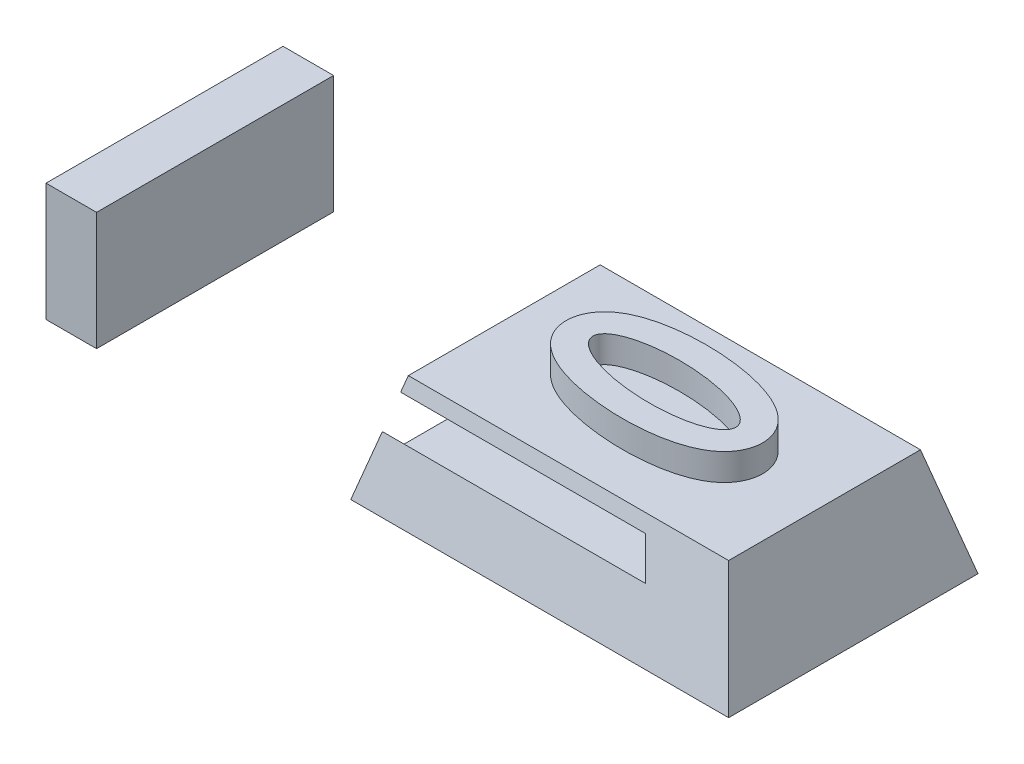
ISO-10303-21;
HEADER;
FILE_DESCRIPTION(('STEP AP214'),'2;1');
FILE_NAME('part.step','',(''),(''),'','','');
FILE_SCHEMA(('AUTOMOTIVE_DESIGN { 1 0 10303 214 1 1 1 1 }'));
ENDSEC;
DATA;
#1=APPLICATION_CONTEXT('core data for automotive mechanical design processes');
#2=APPLICATION_PROTOCOL_DEFINITION('international standard','automotive_design',2000,#1);
#3=PRODUCT_CONTEXT('',#1,'mechanical');
#4=PRODUCT('Part','Part','',(#3));
#5=PRODUCT_RELATED_PRODUCT_CATEGORY('part','',(#4));
#6=PRODUCT_DEFINITION_FORMATION('','',#4);
#7=PRODUCT_DEFINITION_CONTEXT('part definition',#1,'design');
#8=PRODUCT_DEFINITION('design','',#6,#7);
#9=PRODUCT_DEFINITION_SHAPE('','',#8);
#10=(LENGTH_UNIT() NAMED_UNIT(*) SI_UNIT(.MILLI.,.METRE.));
#11=(NAMED_UNIT(*) PLANE_ANGLE_UNIT() SI_UNIT($,.RADIAN.));
#12=(NAMED_UNIT(*) SI_UNIT($,.STERADIAN.) SOLID_ANGLE_UNIT());
#13=UNCERTAINTY_MEASURE_WITH_UNIT(LENGTH_MEASURE(1.E-05),#10,'distance_accuracy_value','');
#14=(GEOMETRIC_REPRESENTATION_CONTEXT(3) GLOBAL_UNCERTAINTY_ASSIGNED_CONTEXT((#13)) GLOBAL_UNIT_ASSIGNED_CONTEXT((#10,
#11,#12)) REPRESENTATION_CONTEXT('',''));
#15=CARTESIAN_POINT('',(0.,0.,0.));
#16=DIRECTION('',(0.,0.,1.));
#17=DIRECTION('',(1.,0.,0.));
#18=AXIS2_PLACEMENT_3D('',#15,#16,#17);
#19=CARTESIAN_POINT('',(-83.2062043670231,22.,-21.5865152838973));
#20=DIRECTION('',(-1.,0.,0.));
#21=DIRECTION('',(0.,0.,1.));
#22=AXIS2_PLACEMENT_3D('',#19,#20,#21);
#23=PLANE('',#22);
#24=DIRECTION('',(0.,0.,-1.));
#25=VECTOR('',#24,1.);
#26=CARTESIAN_POINT('',(-83.2062043670231,0.,-21.5865152838973));
#27=LINE('',#26,#25);
#28=CARTESIAN_POINT('',(-83.2062043670231,0.,22.5677205240746));
#29=VERTEX_POINT('',#28);
#30=CARTESIAN_POINT('',(-83.2062043670231,0.,-21.5865152838973));
#31=VERTEX_POINT('',#30);
#32=EDGE_CURVE('E132',#29,#31,#27,.T.);
#33=ORIENTED_EDGE('',*,*,#32,.T.);
#34=DIRECTION('',(0.,-1.,0.));
#35=VECTOR('',#34,1.);
#36=CARTESIAN_POINT('',(-83.2062043670231,22.,-21.5865152838973));
#37=LINE('',#36,#35);
#38=CARTESIAN_POINT('',(-83.2062043670231,22.,-21.5865152838973));
#39=VERTEX_POINT('',#38);
#40=EDGE_CURVE('E13',#39,#31,#37,.T.);
#41=ORIENTED_EDGE('',*,*,#40,.F.);
#42=DIRECTION('',(0.,0.,-1.));
#43=VECTOR('',#42,1.);
#44=CARTESIAN_POINT('',(-83.2062043670231,22.,-21.5865152838973));
#45=LINE('',#44,#43);
#46=CARTESIAN_POINT('',(-83.2062043670231,22.,22.5677205240746));
#47=VERTEX_POINT('',#46);
#48=EDGE_CURVE('E120',#47,#39,#45,.T.);
#49=ORIENTED_EDGE('',*,*,#48,.F.);
#50=DIRECTION('',(0.,-1.,0.));
#51=VECTOR('',#50,1.);
#52=CARTESIAN_POINT('',(-83.2062043670231,22.,22.5677205240746));
#53=LINE('',#52,#51);
#54=EDGE_CURVE('E128',#47,#29,#53,.T.);
#55=ORIENTED_EDGE('',*,*,#54,.T.);
#56=EDGE_LOOP('',(#33,#41,#49,#55));
#57=FACE_BOUND('',#56,.T.);
#58=ADVANCED_FACE('F69',(#57),#23,.F.);
#59=CARTESIAN_POINT('',(-92.6257746727238,22.,-21.5865152838973));
#60=DIRECTION('',(0.,0.,1.));
#61=DIRECTION('',(1.,0.,0.));
#62=AXIS2_PLACEMENT_3D('',#59,#60,#61);
#63=PLANE('',#62);
#64=DIRECTION('',(-1.,0.,0.));
#65=VECTOR('',#64,1.);
#66=CARTESIAN_POINT('',(-92.6257746727238,0.,-21.5865152838973));
#67=LINE('',#66,#65);
#68=CARTESIAN_POINT('',(-92.6257746727238,0.,-21.5865152838973));
#69=VERTEX_POINT('',#68);
#70=EDGE_CURVE('E124',#31,#69,#67,.T.);
#71=ORIENTED_EDGE('',*,*,#70,.T.);
#72=DIRECTION('',(0.,-1.,0.));
#73=VECTOR('',#72,1.);
#74=CARTESIAN_POINT('',(-92.6257746727238,22.,-21.5865152838973));
#75=LINE('',#74,#73);
#76=CARTESIAN_POINT('',(-92.6257746727238,22.,-21.5865152838973));
#77=VERTEX_POINT('',#76);
#78=EDGE_CURVE('E77',#77,#69,#75,.T.);
#79=ORIENTED_EDGE('',*,*,#78,.F.);
#80=DIRECTION('',(-1.,0.,0.));
#81=VECTOR('',#80,1.);
#82=CARTESIAN_POINT('',(-92.6257746727238,22.,-21.5865152838973));
#83=LINE('',#82,#81);
#84=EDGE_CURVE('E115',#39,#77,#83,.T.);
#85=ORIENTED_EDGE('',*,*,#84,.F.);
#86=ORIENTED_EDGE('',*,*,#40,.T.);
#87=EDGE_LOOP('',(#71,#79,#85,#86));
#88=FACE_BOUND('',#87,.T.);
#89=ADVANCED_FACE('F123',(#88),#63,.F.);
#90=CARTESIAN_POINT('',(-92.6257746727238,22.,-21.5865152838973));
#91=DIRECTION('',(1.,0.,0.));
#92=DIRECTION('',(0.,0.,-1.));
#93=AXIS2_PLACEMENT_3D('',#90,#91,#92);
#94=PLANE('',#93);
#95=DIRECTION('',(0.,0.,1.));
#96=VECTOR('',#95,1.);
#97=CARTESIAN_POINT('',(-92.6257746727238,0.,-21.5865152838973));
#98=LINE('',#97,#96);
#99=CARTESIAN_POINT('',(-92.6257746727238,0.,22.5677205240746));
#100=VERTEX_POINT('',#99);
#101=EDGE_CURVE('E102',#69,#100,#98,.T.);
#102=ORIENTED_EDGE('',*,*,#101,.T.);
#103=DIRECTION('',(0.,-1.,0.));
#104=VECTOR('',#103,1.);
#105=CARTESIAN_POINT('',(-92.6257746727238,22.,22.5677205240746));
#106=LINE('',#105,#104);
#107=CARTESIAN_POINT('',(-92.6257746727238,22.,22.5677205240746));
#108=VERTEX_POINT('',#107);
#109=EDGE_CURVE('E125',#108,#100,#106,.T.);
#110=ORIENTED_EDGE('',*,*,#109,.F.);
#111=DIRECTION('',(0.,0.,1.));
#112=VECTOR('',#111,1.);
#113=CARTESIAN_POINT('',(-92.6257746727238,22.,-21.5865152838973));
#114=LINE('',#113,#112);
#115=EDGE_CURVE('E118',#77,#108,#114,.T.);
#116=ORIENTED_EDGE('',*,*,#115,.F.);
#117=ORIENTED_EDGE('',*,*,#78,.T.);
#118=EDGE_LOOP('',(#102,#110,#116,#117));
#119=FACE_BOUND('',#118,.T.);
#120=ADVANCED_FACE('F126',(#119),#94,.F.);
#121=CARTESIAN_POINT('',(-92.6257746727238,22.,22.5677205240746));
#122=DIRECTION('',(0.,0.,-1.));
#123=DIRECTION('',(-1.,0.,0.));
#124=AXIS2_PLACEMENT_3D('',#121,#122,#123);
#125=PLANE('',#124);
#126=DIRECTION('',(1.,0.,0.));
#127=VECTOR('',#126,1.);
#128=CARTESIAN_POINT('',(-92.6257746727238,0.,22.5677205240746));
#129=LINE('',#128,#127);
#130=EDGE_CURVE('E108',#100,#29,#129,.T.);
#131=ORIENTED_EDGE('',*,*,#130,.T.);
#132=ORIENTED_EDGE('',*,*,#54,.F.);
#133=DIRECTION('',(1.,0.,0.));
#134=VECTOR('',#133,1.);
#135=CARTESIAN_POINT('',(-92.6257746727238,22.,22.5677205240746));
#136=LINE('',#135,#134);
#137=EDGE_CURVE('E85',#108,#47,#136,.T.);
#138=ORIENTED_EDGE('',*,*,#137,.F.);
#139=ORIENTED_EDGE('',*,*,#109,.T.);
#140=EDGE_LOOP('',(#131,#132,#138,#139));
#141=FACE_BOUND('',#140,.T.);
#142=ADVANCED_FACE('F139',(#141),#125,.F.);
#143=CARTESIAN_POINT('',(0.,22.,0.));
#144=DIRECTION('',(0.,1.,0.));
#145=DIRECTION('',(0.,0.,1.));
#146=AXIS2_PLACEMENT_3D('',#143,#144,#145);
#147=PLANE('',#146);
#148=ORIENTED_EDGE('',*,*,#48,.T.);
#149=ORIENTED_EDGE('',*,*,#84,.T.);
#150=ORIENTED_EDGE('',*,*,#115,.T.);
#151=ORIENTED_EDGE('',*,*,#137,.T.);
#152=EDGE_LOOP('',(#148,#149,#150,#151));
#153=FACE_BOUND('',#152,.T.);
#154=ADVANCED_FACE('F116',(#153),#147,.T.);
#155=CARTESIAN_POINT('',(0.,0.,0.));
#156=DIRECTION('',(0.,1.,0.));
#157=DIRECTION('',(0.,0.,1.));
#158=AXIS2_PLACEMENT_3D('',#155,#156,#157);
#159=PLANE('',#158);
#160=ORIENTED_EDGE('',*,*,#32,.F.);
#161=ORIENTED_EDGE('',*,*,#130,.F.);
#162=ORIENTED_EDGE('',*,*,#101,.F.);
#163=ORIENTED_EDGE('',*,*,#70,.F.);
#164=EDGE_LOOP('',(#160,#161,#162,#163));
#165=FACE_BOUND('',#164,.T.);
#166=ADVANCED_FACE('F142',(#165),#159,.F.);
#167=CLOSED_SHELL('',(#58,#89,#120,#142,#154,#166));
#168=MANIFOLD_SOLID_BREP('B2',#167);
#169=CARTESIAN_POINT('',(-35.192375446695,0.,-23.2269677948187));
#170=DIRECTION('',(-0.965925826289068,0.258819045102521,0.));
#171=DIRECTION('',(-0.258819045102521,-0.965925826289068,0.));
#172=AXIS2_PLACEMENT_3D('',#169,#170,#171);
#173=PLANE('',#172);
#174=DIRECTION('',(0.,0.,1.));
#175=VECTOR('',#174,1.);
#176=CARTESIAN_POINT('',(-30.5489939558643,17.3293356427049,-23.2269677948187));
#177=LINE('',#176,#175);
#178=CARTESIAN_POINT('',(-30.5489939558643,17.3293356427049,18.583586303988));
#179=VERTEX_POINT('',#178);
#180=CARTESIAN_POINT('',(-30.5489939558643,17.3293356427049,-16.2991762572844));
#181=VERTEX_POINT('',#180);
#182=EDGE_CURVE('E314',#179,#181,#177,.F.);
#183=ORIENTED_EDGE('',*,*,#182,.F.);
#184=DIRECTION('',(-0.250562807085732,-0.935113126531029,0.250562807085732));
#185=VECTOR('',#184,1.);
#186=CARTESIAN_POINT('',(-35.192375446695,0.,23.2269677948187));
#187=LINE('',#186,#185);
#188=CARTESIAN_POINT('',(-29.8333915980725,20.,17.8679839461962));
#189=VERTEX_POINT('',#188);
#190=EDGE_CURVE('E375',#189,#179,#187,.T.);
#191=ORIENTED_EDGE('',*,*,#190,.F.);
#192=DIRECTION('',(0.,0.,1.));
#193=VECTOR('',#192,1.);
#194=CARTESIAN_POINT('',(-29.8333915980725,20.,-23.2269677948187));
#195=LINE('',#194,#193);
#196=CARTESIAN_POINT('',(-29.8333915980725,20.,-17.8679839461962));
#197=VERTEX_POINT('',#196);
#198=EDGE_CURVE('E337',#189,#197,#195,.F.);
#199=ORIENTED_EDGE('',*,*,#198,.T.);
#200=DIRECTION('',(-0.250562807085732,-0.935113126531029,-0.250562807085732));
#201=VECTOR('',#200,1.);
#202=CARTESIAN_POINT('',(-35.192375446695,0.,-23.2269677948187));
#203=LINE('',#202,#201);
#204=CARTESIAN_POINT('',(-35.192375446695,0.,-23.2269677948187));
#205=VERTEX_POINT('',#204);
#206=EDGE_CURVE('E371',#197,#205,#203,.T.);
#207=ORIENTED_EDGE('',*,*,#206,.T.);
#208=DIRECTION('',(0.,0.,1.));
#209=VECTOR('',#208,1.);
#210=CARTESIAN_POINT('',(-35.192375446695,0.,-23.2269677948187));
#211=LINE('',#210,#209);
#212=CARTESIAN_POINT('',(-35.192375446695,0.,-16.2991762572844));
#213=VERTEX_POINT('',#212);
#214=EDGE_CURVE('E359',#205,#213,#211,.T.);
#215=ORIENTED_EDGE('',*,*,#214,.T.);
#216=DIRECTION('',(0.258819045102521,0.965925826289068,0.));
#217=VECTOR('',#216,1.);
#218=CARTESIAN_POINT('',(-35.192375446695,0.,-16.2991762572844));
#219=LINE('',#218,#217);
#220=CARTESIAN_POINT('',(-34.0763582072008,4.16503303991518,-16.2991762572844));
#221=VERTEX_POINT('',#220);
#222=EDGE_CURVE('E219',#221,#213,#219,.F.);
#223=ORIENTED_EDGE('',*,*,#222,.F.);
#224=DIRECTION('',(0.,0.,1.));
#225=VECTOR('',#224,1.);
#226=CARTESIAN_POINT('',(-34.0763582072008,4.16503303991518,-23.2269677948187));
#227=LINE('',#226,#225);
#228=CARTESIAN_POINT('',(-34.0763582072008,4.16503303991517,20.286381877483));
#229=VERTEX_POINT('',#228);
#230=EDGE_CURVE('E330',#229,#221,#227,.F.);
#231=ORIENTED_EDGE('',*,*,#230,.F.);
#232=DIRECTION('',(-0.258819045102521,-0.965925826289068,0.));
#233=VECTOR('',#232,1.);
#234=CARTESIAN_POINT('',(-35.192375446695,0.,20.286381877483));
#235=LINE('',#234,#233);
#236=CARTESIAN_POINT('',(-35.192375446695,0.,20.286381877483));
#237=VERTEX_POINT('',#236);
#238=EDGE_CURVE('E333',#237,#229,#235,.F.);
#239=ORIENTED_EDGE('',*,*,#238,.F.);
#240=CARTESIAN_POINT('',(-35.192375446695,0.,23.2269677948187));
#241=VERTEX_POINT('',#240);
#242=EDGE_CURVE('E358',#237,#241,#211,.T.);
#243=ORIENTED_EDGE('',*,*,#242,.T.);
#244=CARTESIAN_POINT('',(-32.2517895293593,10.9744160475184,20.286381877483));
#245=VERTEX_POINT('',#244);
#246=EDGE_CURVE('E374',#245,#241,#187,.T.);
#247=ORIENTED_EDGE('',*,*,#246,.F.);
#248=DIRECTION('',(-0.258819045102521,-0.965925826289068,0.));
#249=VECTOR('',#248,1.);
#250=CARTESIAN_POINT('',(-35.192375446695,0.,20.286381877483));
#251=LINE('',#250,#249);
#252=CARTESIAN_POINT('',(-33.7349477329932,5.43919427589401,20.286381877483));
#253=VERTEX_POINT('',#252);
#254=EDGE_CURVE('E310',#253,#245,#251,.F.);
#255=ORIENTED_EDGE('',*,*,#254,.F.);
#256=DIRECTION('',(0.,0.,1.));
#257=VECTOR('',#256,1.);
#258=CARTESIAN_POINT('',(-33.7349477329932,5.43919427589401,-23.2269677948187));
#259=LINE('',#258,#257);
#260=CARTESIAN_POINT('',(-33.7349477329932,5.43919427589401,-16.2991762572844));
#261=VERTEX_POINT('',#260);
#262=EDGE_CURVE('E204',#253,#261,#259,.F.);
#263=ORIENTED_EDGE('',*,*,#262,.T.);
#264=DIRECTION('',(-0.258819045102521,-0.965925826289068,0.));
#265=VECTOR('',#264,1.);
#266=CARTESIAN_POINT('',(-35.192375446695,0.,-16.2991762572844));
#267=LINE('',#266,#265);
#268=EDGE_CURVE('E67',#261,#181,#267,.F.);
#269=ORIENTED_EDGE('',*,*,#268,.T.);
#270=EDGE_LOOP('',(#183,#191,#199,#207,#215,#223,#231,#239,#243,#247,#255,#263,#269));
#271=FACE_BOUND('',#270,.T.);
#272=ADVANCED_FACE('F194',(#271),#173,.T.);
#273=CARTESIAN_POINT('',(-35.192375446695,0.,23.2269677948187));
#274=DIRECTION('',(0.,0.258819045102521,0.965925826289068));
#275=DIRECTION('',(0.,-0.965925826289068,0.258819045102521));
#276=AXIS2_PLACEMENT_3D('',#273,#274,#275);
#277=PLANE('',#276);
#278=DIRECTION('',(1.,0.,0.));
#279=VECTOR('',#278,1.);
#280=CARTESIAN_POINT('',(-35.192375446695,17.3293356427049,18.583586303988));
#281=LINE('',#280,#279);
#282=CARTESIAN_POINT('',(15.0198512497131,17.3293356427049,18.583586303988));
#283=VERTEX_POINT('',#282);
#284=EDGE_CURVE('E606',#283,#179,#281,.F.);
#285=ORIENTED_EDGE('',*,*,#284,.F.);
#286=DIRECTION('',(-0.250562807085732,0.935113126531029,-0.250562807085732));
#287=VECTOR('',#286,1.);
#288=CARTESIAN_POINT('',(16.2193032907379,12.8529196843582,19.7830383450128));
#289=LINE('',#288,#287);
#290=CARTESIAN_POINT('',(16.722646823208,10.9744160475183,20.286381877483));
#291=VERTEX_POINT('',#290);
#292=EDGE_CURVE('E601',#291,#283,#289,.T.);
#293=ORIENTED_EDGE('',*,*,#292,.F.);
#294=DIRECTION('',(-1.,0.,0.));
#295=VECTOR('',#294,1.);
#296=CARTESIAN_POINT('',(-35.192375446695,10.9744160475184,20.286381877483));
#297=LINE('',#296,#295);
#298=EDGE_CURVE('E290',#245,#291,#297,.F.);
#299=ORIENTED_EDGE('',*,*,#298,.F.);
#300=ORIENTED_EDGE('',*,*,#246,.T.);
#301=DIRECTION('',(1.,0.,0.));
#302=VECTOR('',#301,1.);
#303=CARTESIAN_POINT('',(-35.192375446695,0.,23.2269677948187));
#304=LINE('',#303,#302);
#305=CARTESIAN_POINT('',(35.192375446695,0.,23.2269677948187));
#306=VERTEX_POINT('',#305);
#307=EDGE_CURVE('E363',#241,#306,#304,.T.);
#308=ORIENTED_EDGE('',*,*,#307,.T.);
#309=DIRECTION('',(0.250562807085732,-0.935113126531029,0.250562807085732));
#310=VECTOR('',#309,1.);
#311=CARTESIAN_POINT('',(32.2759174559192,10.8843693997154,20.3105098040429));
#312=LINE('',#311,#310);
#313=CARTESIAN_POINT('',(29.8333915980725,20.,17.8679839461962));
#314=VERTEX_POINT('',#313);
#315=EDGE_CURVE('E367',#314,#306,#312,.T.);
#316=ORIENTED_EDGE('',*,*,#315,.F.);
#317=DIRECTION('',(1.,0.,0.));
#318=VECTOR('',#317,1.);
#319=CARTESIAN_POINT('',(-35.192375446695,20.,17.8679839461962));
#320=LINE('',#319,#318);
#321=EDGE_CURVE('E342',#314,#189,#320,.F.);
#322=ORIENTED_EDGE('',*,*,#321,.T.);
#323=ORIENTED_EDGE('',*,*,#190,.T.);
#324=EDGE_LOOP('',(#285,#293,#299,#300,#308,#316,#322,#323));
#325=FACE_BOUND('',#324,.T.);
#326=ADVANCED_FACE('F425',(#325),#277,.T.);
#327=CARTESIAN_POINT('',(0.,0.,0.));
#328=DIRECTION('',(0.,1.,0.));
#329=DIRECTION('',(0.,0.,1.));
#330=AXIS2_PLACEMENT_3D('',#327,#328,#329);
#331=PLANE('',#330);
#332=DIRECTION('',(-1.,0.,0.));
#333=VECTOR('',#332,1.);
#334=CARTESIAN_POINT('',(0.,0.,20.286381877483));
#335=LINE('',#334,#333);
#336=CARTESIAN_POINT('',(-18.5322432870343,0.,20.286381877483));
#337=VERTEX_POINT('',#336);
#338=EDGE_CURVE('E596',#337,#237,#335,.T.);
#339=ORIENTED_EDGE('',*,*,#338,.F.);
#340=DIRECTION('',(0.,0.,1.));
#341=VECTOR('',#340,1.);
#342=CARTESIAN_POINT('',(-18.5322432870343,0.,0.));
#343=LINE('',#342,#341);
#344=CARTESIAN_POINT('',(-18.5322432870343,0.,-16.2991762572844));
#345=VERTEX_POINT('',#344);
#346=EDGE_CURVE('E593',#345,#337,#343,.T.);
#347=ORIENTED_EDGE('',*,*,#346,.F.);
#348=DIRECTION('',(1.,0.,0.));
#349=VECTOR('',#348,1.);
#350=CARTESIAN_POINT('',(0.,0.,-16.2991762572844));
#351=LINE('',#350,#349);
#352=EDGE_CURVE('E390',#213,#345,#351,.T.);
#353=ORIENTED_EDGE('',*,*,#352,.F.);
#354=ORIENTED_EDGE('',*,*,#214,.F.);
#355=DIRECTION('',(-1.,0.,0.));
#356=VECTOR('',#355,1.);
#357=CARTESIAN_POINT('',(-35.192375446695,0.,-23.2269677948187));
#358=LINE('',#357,#356);
#359=CARTESIAN_POINT('',(35.192375446695,0.,-23.2269677948187));
#360=VERTEX_POINT('',#359);
#361=EDGE_CURVE('E354',#360,#205,#358,.T.);
#362=ORIENTED_EDGE('',*,*,#361,.F.);
#363=DIRECTION('',(0.,0.,-1.));
#364=VECTOR('',#363,1.);
#365=CARTESIAN_POINT('',(35.192375446695,0.,-23.2269677948187));
#366=LINE('',#365,#364);
#367=EDGE_CURVE('E336',#306,#360,#366,.T.);
#368=ORIENTED_EDGE('',*,*,#367,.F.);
#369=ORIENTED_EDGE('',*,*,#307,.F.);
#370=ORIENTED_EDGE('',*,*,#242,.F.);
#371=EDGE_LOOP('',(#339,#347,#353,#354,#362,#368,#369,#370));
#372=FACE_BOUND('',#371,.T.);
#373=ADVANCED_FACE('F431',(#372),#331,.F.);
#374=CARTESIAN_POINT('',(35.192375446695,0.,-23.2269677948187));
#375=DIRECTION('',(0.965925826289068,0.258819045102521,0.));
#376=DIRECTION('',(-0.258819045102521,0.965925826289068,0.));
#377=AXIS2_PLACEMENT_3D('',#374,#375,#376);
#378=PLANE('',#377);
#379=DIRECTION('',(0.250562807085732,-0.935113126531029,-0.250562807085732));
#380=VECTOR('',#379,1.);
#381=CARTESIAN_POINT('',(30.7734997030953,16.4914687874476,-18.808092051219));
#382=LINE('',#381,#380);
#383=CARTESIAN_POINT('',(29.8333915980725,20.,-17.8679839461962));
#384=VERTEX_POINT('',#383);
#385=EDGE_CURVE('E368',#384,#360,#382,.T.);
#386=ORIENTED_EDGE('',*,*,#385,.F.);
#387=DIRECTION('',(0.,0.,-1.));
#388=VECTOR('',#387,1.);
#389=CARTESIAN_POINT('',(29.8333915980725,20.,-23.2269677948187));
#390=LINE('',#389,#388);
#391=EDGE_CURVE('E346',#384,#314,#390,.F.);
#392=ORIENTED_EDGE('',*,*,#391,.T.);
#393=ORIENTED_EDGE('',*,*,#315,.T.);
#394=ORIENTED_EDGE('',*,*,#367,.T.);
#395=EDGE_LOOP('',(#386,#392,#393,#394));
#396=FACE_BOUND('',#395,.T.);
#397=ADVANCED_FACE('F436',(#396),#378,.T.);
#398=CARTESIAN_POINT('',(-35.192375446695,0.,-23.2269677948187));
#399=DIRECTION('',(0.,0.258819045102521,-0.965925826289068));
#400=DIRECTION('',(0.,0.965925826289068,0.258819045102521));
#401=AXIS2_PLACEMENT_3D('',#398,#399,#400);
#402=PLANE('',#401);
#403=ORIENTED_EDGE('',*,*,#206,.F.);
#404=DIRECTION('',(-1.,0.,0.));
#405=VECTOR('',#404,1.);
#406=CARTESIAN_POINT('',(-35.192375446695,20.,-17.8679839461962));
#407=LINE('',#406,#405);
#408=EDGE_CURVE('E341',#197,#384,#407,.F.);
#409=ORIENTED_EDGE('',*,*,#408,.T.);
#410=ORIENTED_EDGE('',*,*,#385,.T.);
#411=ORIENTED_EDGE('',*,*,#361,.T.);
#412=EDGE_LOOP('',(#403,#409,#410,#411));
#413=FACE_BOUND('',#412,.T.);
#414=ADVANCED_FACE('F409',(#413),#402,.T.);
#415=CARTESIAN_POINT('',(18.9932272029198,20.,1.16922991230946));
#416=DIRECTION('',(0.,-1.,0.));
#417=DIRECTION('',(0.,0.,-1.));
#418=AXIS2_PLACEMENT_3D('',#415,#416,#417);
#419=PLANE('',#418);
#420=CARTESIAN_POINT('',(-18.9981760957523,20.,-1.09111146495867));
#421=CARTESIAN_POINT('',(-19.0267077318382,20.,-0.594325330757295));
#422=CARTESIAN_POINT('',(-18.9993673168674,20.,-0.104018854458411));
#423=CARTESIAN_POINT('',(-18.8392255201408,20.,0.864363457346522));
#424=CARTESIAN_POINT('',(-18.7036809106218,20.,1.34720338051496));
#425=CARTESIAN_POINT('',(-18.3399848004646,20.,2.26185111659314));
#426=CARTESIAN_POINT('',(-18.1122615266583,20.,2.69722343052151));
#427=CARTESIAN_POINT('',(-17.7071335672733,20.,3.31987618978932));
#428=CARTESIAN_POINT('',(-17.5618214313466,20.,3.52155122897258));
#429=CARTESIAN_POINT('',(-17.2569618440686,20.,3.90781667542782));
#430=CARTESIAN_POINT('',(-17.0967814183963,20.,4.09340312129588));
#431=CARTESIAN_POINT('',(-16.5951770891298,20.,4.62965475918853));
#432=CARTESIAN_POINT('',(-16.2327559734832,20.,4.95987635574332));
#433=CARTESIAN_POINT('',(-15.4610714420073,20.,5.57471230188011));
#434=CARTESIAN_POINT('',(-15.0543474967644,20.,5.85695504990956));
#435=CARTESIAN_POINT('',(-13.8059548363683,20.,6.63094111969998));
#436=CARTESIAN_POINT('',(-12.9277641237619,20.,7.05864825345388));
#437=CARTESIAN_POINT('',(-11.5664354828836,20.,7.61555130718436));
#438=CARTESIAN_POINT('',(-11.1038413529695,20.,7.78706043725755));
#439=CARTESIAN_POINT('',(-10.1745872572291,20.,8.10262756413627));
#440=CARTESIAN_POINT('',(-9.70740490812622,20.,8.24697843778653));
#441=CARTESIAN_POINT('',(-8.2994133928201,20.,8.64615382408659));
#442=CARTESIAN_POINT('',(-7.35223484964202,20.,8.86749584005155));
#443=CARTESIAN_POINT('',(-4.49058172230907,20.,9.42576836511235));
#444=CARTESIAN_POINT('',(-2.55646515945704,20.,9.65944505688745));
#445=CARTESIAN_POINT('',(1.3572938743582,20.,9.88747816258051));
#446=CARTESIAN_POINT('',(3.30332724513649,20.,9.87970217383467));
#447=CARTESIAN_POINT('',(6.20065346414526,20.,9.65983033012206));
#448=CARTESIAN_POINT('',(7.16290696160551,20.,9.55121436038316));
#449=CARTESIAN_POINT('',(9.07857186717901,20.,9.24529473544612));
#450=CARTESIAN_POINT('',(10.0320463688177,20.,9.04862391922063));
#451=CARTESIAN_POINT('',(11.4527188415897,20.,8.65793706973878));
#452=CARTESIAN_POINT('',(11.9266494002782,20.,8.51074697069084));
#453=CARTESIAN_POINT('',(12.8556930698496,20.,8.18005656134168));
#454=CARTESIAN_POINT('',(13.3116443866783,20.,7.99650308753968));
#455=CARTESIAN_POINT('',(14.2022304084425,20.,7.58410849125647));
#456=CARTESIAN_POINT('',(14.6368912184498,20.,7.35532282962073));
#457=CARTESIAN_POINT('',(15.4788777589354,20.,6.8396774801146));
#458=CARTESIAN_POINT('',(15.887069074497,20.,6.55135802591647));
#459=CARTESIAN_POINT('',(16.6437000066144,20.,5.92052782189666));
#460=CARTESIAN_POINT('',(16.9952484019788,20.,5.57650296312598));
#461=CARTESIAN_POINT('',(17.4749007915368,20.,5.00951378179786));
#462=CARTESIAN_POINT('',(17.6274031634747,20.,4.81096137143449));
#463=CARTESIAN_POINT('',(17.9087066386202,20.,4.4042690331016));
#464=CARTESIAN_POINT('',(18.0382575800036,20.,4.19541772023871));
#465=CARTESIAN_POINT('',(18.3930852144539,20.,3.55208908128783));
#466=CARTESIAN_POINT('',(18.5848671436552,20.,3.10100092071424));
#467=CARTESIAN_POINT('',(18.7986825423708,20.,2.38774102571306));
#468=CARTESIAN_POINT('',(18.857193023084,20.,2.14422850802779));
#469=CARTESIAN_POINT('',(18.9457016464839,20.,1.65835740314654));
#470=CARTESIAN_POINT('',(19.0067941740651,20.,1.17030790128338));
#471=CARTESIAN_POINT('',(19.0136188170651,20.,0.677946443525437));
#472=CARTESIAN_POINT('',(18.992794611167,20.,0.183388094956007));
#473=CARTESIAN_POINT('',(18.9682357598339,20.,-0.0662972422082644));
#474=CARTESIAN_POINT('',(18.8545006512395,20.,-0.80123160206327));
#475=CARTESIAN_POINT('',(18.7259876831463,20.,-1.27686100980641));
#476=CARTESIAN_POINT('',(18.4583264033897,20.,-1.96994126572941));
#477=CARTESIAN_POINT('',(18.3559318110125,20.,-2.19856170621388));
#478=CARTESIAN_POINT('',(18.1305158690954,20.,-2.64053260530794));
#479=CARTESIAN_POINT('',(18.0073155952707,20.,-2.85468131840407));
#480=CARTESIAN_POINT('',(17.7413824833503,20.,-3.27025141525469));
#481=CARTESIAN_POINT('',(17.598643631296,20.,-3.47166888034129));
#482=CARTESIAN_POINT('',(17.2947289229338,20.,-3.86249034305805));
#483=CARTESIAN_POINT('',(17.1327876632187,20.,-4.05267269789182));
#484=CARTESIAN_POINT('',(16.290405012133,20.,-4.96338544597655));
#485=CARTESIAN_POINT('',(15.5156871774744,20.,-5.56711107738108));
#486=CARTESIAN_POINT('',(14.2570127766273,20.,-6.3530736278756));
#487=CARTESIAN_POINT('',(13.8226530547682,20.,-6.5934020960981));
#488=CARTESIAN_POINT('',(12.9432362499361,20.,-7.03355181224195));
#489=CARTESIAN_POINT('',(12.4961297354391,20.,-7.2346134269849));
#490=CARTESIAN_POINT('',(11.1371274072135,20.,-7.79235328670746));
#491=CARTESIAN_POINT('',(10.2078194286358,20.,-8.10428204377234));
#492=CARTESIAN_POINT('',(8.7888103379926,20.,-8.50780375124965));
#493=CARTESIAN_POINT('',(8.31054476572896,20.,-8.63158618700854));
#494=CARTESIAN_POINT('',(7.3527015573306,20.,-8.85817104224004));
#495=CARTESIAN_POINT('',(6.87295546875991,20.,-8.96107358093292));
#496=CARTESIAN_POINT('',(4.47055732453037,20.,-9.42936707217322));
#497=CARTESIAN_POINT('',(2.53727308723159,20.,-9.66077466486357));
#498=CARTESIAN_POINT('',(-1.34809127745318,20.,-9.88673004191334));
#499=CARTESIAN_POINT('',(-3.30016189695875,20.,-9.88139764154731));
#500=CARTESIAN_POINT('',(-6.24554482380551,20.,-9.65567983119547));
#501=CARTESIAN_POINT('',(-7.2238861310131,20.,-9.54376243681635));
#502=CARTESIAN_POINT('',(-8.67932647320795,20.,-9.30777399442236));
#503=CARTESIAN_POINT('',(-9.16270478462178,20.,-9.21764414240494));
#504=CARTESIAN_POINT('',(-10.1253043939355,20.,-9.01042969791913));
#505=CARTESIAN_POINT('',(-10.6050348590601,20.,-8.89316006813833));
#506=CARTESIAN_POINT('',(-12.0240820200582,20.,-8.49585786176024));
#507=CARTESIAN_POINT('',(-12.947532320885,20.,-8.17140905372789));
#508=CARTESIAN_POINT('',(-14.2796274636538,20.,-7.54468266505282));
#509=CARTESIAN_POINT('',(-14.7172443683622,20.,-7.31039063027969));
#510=CARTESIAN_POINT('',(-15.5550641476396,20.,-6.78786565348421));
#511=CARTESIAN_POINT('',(-15.9540123510794,20.,-6.50082394370224));
#512=CARTESIAN_POINT('',(-16.5161978966339,20.,-6.02346395726845));
#513=CARTESIAN_POINT('',(-16.6975373865574,20.,-5.85652342893126));
#514=CARTESIAN_POINT('',(-17.046752812587,20.,-5.50525506684489));
#515=CARTESIAN_POINT('',(-17.2141197507083,20.,-5.32123953918252));
#516=CARTESIAN_POINT('',(-17.6843488365664,20.,-4.75277808332444));
#517=CARTESIAN_POINT('',(-17.9589954075779,20.,-4.34869227197464));
#518=CARTESIAN_POINT('',(-18.4235599794515,20.,-3.48573974646842));
#519=CARTESIAN_POINT('',(-18.6145423155768,20.,-3.02098597744346));
#520=CARTESIAN_POINT('',(-18.886100797377,20.,-2.07373013078984));
#521=CARTESIAN_POINT('',(-18.9696444596664,20.,-1.58789759916005));
#522=CARTESIAN_POINT('',(-18.9981760957523,20.,-1.09111146495867));
#523=B_SPLINE_CURVE_WITH_KNOTS('',3,(#420,#421,#422,#423,#424,#425,#426,#427,#428,#429,#430,
#431,#432,#433,#434,#435,#436,#437,#438,#439,#440,#441,#442,#443,#444,#445,#446,#447,#448,#449,
#450,#451,#452,#453,#454,#455,#456,#457,#458,#459,#460,#461,#462,#463,#464,#465,#466,#467,#468,
#469,#470,#471,#472,#473,#474,#475,#476,#477,#478,#479,#480,#481,#482,#483,#484,#485,#486,#487,
#488,#489,#490,#491,#492,#493,#494,#495,#496,#497,#498,#499,#500,#501,#502,#503,#504,#505,#506,
#507,#508,#509,#510,#511,#512,#513,#514,#515,#516,#517,#518,#519,#520,#521,#522),.UNSPECIFIED.,
.T.,.F.,(4,2,2,2,2,2,2,2,2,2,2,2,2,2,2,2,2,2,2,2,2,2,2,2,2,1,2,2,2,2,2,2,2,2,2,2,2,2,2,2,2,2,2,
2,2,2,2,2,2,2,2,4),(0.,0.0156249999999998,0.0312499999999996,0.0468749999999993,
0.0546874999999993,0.0624999999999992,0.0781249999999991,0.093749999999999,0.124999999999999,
0.140624999999999,0.156249999999999,0.187499999999999,0.249999999999998,0.312499999999998,
0.343749999999998,0.374999999999998,0.390624999999998,0.406249999999998,0.421874999999998,
0.437499999999998,0.453124999999998,0.460937499999998,0.468749999999998,0.484374999999998,
0.492187499999998,0.499999999999998,0.507812499999998,0.515624999999998,0.531249999999998,
0.539062499999998,0.546874999999998,0.554687499999998,0.562499999999998,0.593749999999998,
0.609374999999998,0.624999999999998,0.656249999999998,0.671874999999999,0.687499999999999,
0.749999999999999,0.812499999999999,0.843749999999999,0.859374999999999,0.874999999999999,
0.906249999999999,0.921875,0.9375,0.9453125,0.953125,0.96875,0.984375,1.),.UNSPECIFIED.);
#524=CARTESIAN_POINT('',(-18.9981760957523,20.,-1.09111146495867));
#525=VERTEX_POINT('',#524);
#526=EDGE_CURVE('E384',#525,#525,#523,.F.);
#527=ORIENTED_EDGE('',*,*,#526,.T.);
#528=EDGE_LOOP('',(#527));
#529=FACE_BOUND('',#528,.T.);
#530=ORIENTED_EDGE('',*,*,#408,.F.);
#531=ORIENTED_EDGE('',*,*,#198,.F.);
#532=ORIENTED_EDGE('',*,*,#321,.F.);
#533=ORIENTED_EDGE('',*,*,#391,.F.);
#534=EDGE_LOOP('',(#530,#531,#532,#533));
#535=FACE_BOUND('',#534,.T.);
#536=ADVANCED_FACE('F421',(#529,#535),#419,.F.);
#537=CARTESIAN_POINT('',(-18.9981760957523,25.,-1.09111146495867));
#538=CARTESIAN_POINT('',(-19.0267077318382,25.,-0.594325330757295));
#539=CARTESIAN_POINT('',(-18.9993673168674,25.,-0.104018854458411));
#540=CARTESIAN_POINT('',(-18.8392255201408,25.,0.864363457346522));
#541=CARTESIAN_POINT('',(-18.7036809106218,25.,1.34720338051496));
#542=CARTESIAN_POINT('',(-18.3399848004646,25.,2.26185111659314));
#543=CARTESIAN_POINT('',(-18.1122615266583,25.,2.69722343052151));
#544=CARTESIAN_POINT('',(-17.7071335672733,25.,3.31987618978932));
#545=CARTESIAN_POINT('',(-17.5618214313466,25.,3.52155122897258));
#546=CARTESIAN_POINT('',(-17.2569618440686,25.,3.90781667542782));
#547=CARTESIAN_POINT('',(-17.0967814183963,25.,4.09340312129588));
#548=CARTESIAN_POINT('',(-16.5951770891298,25.,4.62965475918853));
#549=CARTESIAN_POINT('',(-16.2327559734832,25.,4.95987635574332));
#550=CARTESIAN_POINT('',(-15.4610714420073,25.,5.57471230188011));
#551=CARTESIAN_POINT('',(-15.0543474967644,25.,5.85695504990956));
#552=CARTESIAN_POINT('',(-13.8059548363683,25.,6.63094111969998));
#553=CARTESIAN_POINT('',(-12.9277641237619,25.,7.05864825345388));
#554=CARTESIAN_POINT('',(-11.5664354828836,25.,7.61555130718436));
#555=CARTESIAN_POINT('',(-11.1038413529695,25.,7.78706043725755));
#556=CARTESIAN_POINT('',(-10.1745872572291,25.,8.10262756413627));
#557=CARTESIAN_POINT('',(-9.70740490812622,25.,8.24697843778653));
#558=CARTESIAN_POINT('',(-8.2994133928201,25.,8.64615382408659));
#559=CARTESIAN_POINT('',(-7.35223484964202,25.,8.86749584005155));
#560=CARTESIAN_POINT('',(-4.49058172230907,25.,9.42576836511235));
#561=CARTESIAN_POINT('',(-2.55646515945704,25.,9.65944505688745));
#562=CARTESIAN_POINT('',(1.3572938743582,25.,9.88747816258051));
#563=CARTESIAN_POINT('',(3.30332724513649,25.,9.87970217383467));
#564=CARTESIAN_POINT('',(6.20065346414526,25.,9.65983033012206));
#565=CARTESIAN_POINT('',(7.16290696160551,25.,9.55121436038316));
#566=CARTESIAN_POINT('',(9.07857186717901,25.,9.24529473544612));
#567=CARTESIAN_POINT('',(10.0320463688177,25.,9.04862391922063));
#568=CARTESIAN_POINT('',(11.4527188415897,25.,8.65793706973878));
#569=CARTESIAN_POINT('',(11.9266494002782,25.,8.51074697069084));
#570=CARTESIAN_POINT('',(12.8556930698496,25.,8.18005656134168));
#571=CARTESIAN_POINT('',(13.3116443866783,25.,7.99650308753968));
#572=CARTESIAN_POINT('',(14.2022304084425,25.,7.58410849125647));
#573=CARTESIAN_POINT('',(14.6368912184498,25.,7.35532282962073));
#574=CARTESIAN_POINT('',(15.4788777589354,25.,6.8396774801146));
#575=CARTESIAN_POINT('',(15.887069074497,25.,6.55135802591647));
#576=CARTESIAN_POINT('',(16.6437000066144,25.,5.92052782189666));
#577=CARTESIAN_POINT('',(16.9952484019788,25.,5.57650296312598));
#578=CARTESIAN_POINT('',(17.4749007915368,25.,5.00951378179786));
#579=CARTESIAN_POINT('',(17.6274031634747,25.,4.81096137143449));
#580=CARTESIAN_POINT('',(17.9087066386202,25.,4.4042690331016));
#581=CARTESIAN_POINT('',(18.0382575800036,25.,4.19541772023871));
#582=CARTESIAN_POINT('',(18.3930852144539,25.,3.55208908128783));
#583=CARTESIAN_POINT('',(18.5848671436552,25.,3.10100092071424));
#584=CARTESIAN_POINT('',(18.7986825423708,25.,2.38774102571306));
#585=CARTESIAN_POINT('',(18.857193023084,25.,2.14422850802779));
#586=CARTESIAN_POINT('',(18.9457016464839,25.,1.65835740314654));
#587=CARTESIAN_POINT('',(19.0067941740651,25.,1.17030790128338));
#588=CARTESIAN_POINT('',(19.0136188170651,25.,0.677946443525437));
#589=CARTESIAN_POINT('',(18.992794611167,25.,0.183388094956007));
#590=CARTESIAN_POINT('',(18.9682357598339,25.,-0.0662972422082644));
#591=CARTESIAN_POINT('',(18.8545006512395,25.,-0.80123160206327));
#592=CARTESIAN_POINT('',(18.7259876831463,25.,-1.27686100980641));
#593=CARTESIAN_POINT('',(18.4583264033897,25.,-1.96994126572941));
#594=CARTESIAN_POINT('',(18.3559318110125,25.,-2.19856170621388));
#595=CARTESIAN_POINT('',(18.1305158690954,25.,-2.64053260530794));
#596=CARTESIAN_POINT('',(18.0073155952707,25.,-2.85468131840407));
#597=CARTESIAN_POINT('',(17.7413824833503,25.,-3.27025141525469));
#598=CARTESIAN_POINT('',(17.598643631296,25.,-3.47166888034129));
#599=CARTESIAN_POINT('',(17.2947289229338,25.,-3.86249034305805));
#600=CARTESIAN_POINT('',(17.1327876632187,25.,-4.05267269789182));
#601=CARTESIAN_POINT('',(16.290405012133,25.,-4.96338544597655));
#602=CARTESIAN_POINT('',(15.5156871774744,25.,-5.56711107738108));
#603=CARTESIAN_POINT('',(14.2570127766273,25.,-6.3530736278756));
#604=CARTESIAN_POINT('',(13.8226530547682,25.,-6.5934020960981));
#605=CARTESIAN_POINT('',(12.9432362499361,25.,-7.03355181224195));
#606=CARTESIAN_POINT('',(12.4961297354391,25.,-7.2346134269849));
#607=CARTESIAN_POINT('',(11.1371274072135,25.,-7.79235328670746));
#608=CARTESIAN_POINT('',(10.2078194286358,25.,-8.10428204377234));
#609=CARTESIAN_POINT('',(8.7888103379926,25.,-8.50780375124965));
#610=CARTESIAN_POINT('',(8.31054476572896,25.,-8.63158618700854));
#611=CARTESIAN_POINT('',(7.3527015573306,25.,-8.85817104224004));
#612=CARTESIAN_POINT('',(6.87295546875991,25.,-8.96107358093292));
#613=CARTESIAN_POINT('',(4.47055732453037,25.,-9.42936707217322));
#614=CARTESIAN_POINT('',(2.53727308723159,25.,-9.66077466486357));
#615=CARTESIAN_POINT('',(-1.34809127745318,25.,-9.88673004191334));
#616=CARTESIAN_POINT('',(-3.30016189695875,25.,-9.88139764154731));
#617=CARTESIAN_POINT('',(-6.24554482380551,25.,-9.65567983119547));
#618=CARTESIAN_POINT('',(-7.2238861310131,25.,-9.54376243681635));
#619=CARTESIAN_POINT('',(-8.67932647320795,25.,-9.30777399442236));
#620=CARTESIAN_POINT('',(-9.16270478462178,25.,-9.21764414240494));
#621=CARTESIAN_POINT('',(-10.1253043939355,25.,-9.01042969791913));
#622=CARTESIAN_POINT('',(-10.6050348590601,25.,-8.89316006813833));
#623=CARTESIAN_POINT('',(-12.0240820200582,25.,-8.49585786176024));
#624=CARTESIAN_POINT('',(-12.947532320885,25.,-8.17140905372789));
#625=CARTESIAN_POINT('',(-14.2796274636538,25.,-7.54468266505282));
#626=CARTESIAN_POINT('',(-14.7172443683622,25.,-7.31039063027969));
#627=CARTESIAN_POINT('',(-15.5550641476396,25.,-6.78786565348421));
#628=CARTESIAN_POINT('',(-15.9540123510794,25.,-6.50082394370224));
#629=CARTESIAN_POINT('',(-16.5161978966339,25.,-6.02346395726845));
#630=CARTESIAN_POINT('',(-16.6975373865574,25.,-5.85652342893126));
#631=CARTESIAN_POINT('',(-17.046752812587,25.,-5.50525506684489));
#632=CARTESIAN_POINT('',(-17.2141197507083,25.,-5.32123953918252));
#633=CARTESIAN_POINT('',(-17.6843488365664,25.,-4.75277808332444));
#634=CARTESIAN_POINT('',(-17.9589954075779,25.,-4.34869227197464));
#635=CARTESIAN_POINT('',(-18.4235599794515,25.,-3.48573974646842));
#636=CARTESIAN_POINT('',(-18.6145423155768,25.,-3.02098597744346));
#637=CARTESIAN_POINT('',(-18.886100797377,25.,-2.07373013078984));
#638=CARTESIAN_POINT('',(-18.9696444596664,25.,-1.58789759916005));
#639=CARTESIAN_POINT('',(-18.9981760957523,25.,-1.09111146495867));
#640=B_SPLINE_CURVE_WITH_KNOTS('',3,(#537,#538,#539,#540,#541,#542,#543,#544,#545,#546,#547,
#548,#549,#550,#551,#552,#553,#554,#555,#556,#557,#558,#559,#560,#561,#562,#563,#564,#565,#566,
#567,#568,#569,#570,#571,#572,#573,#574,#575,#576,#577,#578,#579,#580,#581,#582,#583,#584,#585,
#586,#587,#588,#589,#590,#591,#592,#593,#594,#595,#596,#597,#598,#599,#600,#601,#602,#603,#604,
#605,#606,#607,#608,#609,#610,#611,#612,#613,#614,#615,#616,#617,#618,#619,#620,#621,#622,#623,
#624,#625,#626,#627,#628,#629,#630,#631,#632,#633,#634,#635,#636,#637,#638,#639),.UNSPECIFIED.,
.T.,.F.,(4,2,2,2,2,2,2,2,2,2,2,2,2,2,2,2,2,2,2,2,2,2,2,2,2,1,2,2,2,2,2,2,2,2,2,2,2,2,2,2,2,2,2,
2,2,2,2,2,2,2,2,4),(0.,0.0156249999999998,0.0312499999999996,0.0468749999999993,
0.0546874999999993,0.0624999999999992,0.0781249999999991,0.093749999999999,0.124999999999999,
0.140624999999999,0.156249999999999,0.187499999999999,0.249999999999998,0.312499999999998,
0.343749999999998,0.374999999999998,0.390624999999998,0.406249999999998,0.421874999999998,
0.437499999999998,0.453124999999998,0.460937499999998,0.468749999999998,0.484374999999998,
0.492187499999998,0.499999999999998,0.507812499999998,0.515624999999998,0.531249999999998,
0.539062499999998,0.546874999999998,0.554687499999998,0.562499999999998,0.593749999999998,
0.609374999999998,0.624999999999998,0.656249999999998,0.671874999999999,0.687499999999999,
0.749999999999999,0.812499999999999,0.843749999999999,0.859374999999999,0.874999999999999,
0.906249999999999,0.921875,0.9375,0.9453125,0.953125,0.96875,0.984375,1.),.UNSPECIFIED.);
#641=DIRECTION('',(0.,-1.,0.));
#642=VECTOR('',#641,1.);
#643=SURFACE_OF_LINEAR_EXTRUSION('',#640,#642);
#644=CARTESIAN_POINT('',(-18.9981760957523,25.,-1.09111146495867));
#645=VERTEX_POINT('',#644);
#646=EDGE_CURVE('E391',#645,#645,#640,.T.);
#647=ORIENTED_EDGE('',*,*,#646,.F.);
#648=EDGE_LOOP('',(#647));
#649=FACE_BOUND('',#648,.T.);
#650=ORIENTED_EDGE('',*,*,#526,.F.);
#651=EDGE_LOOP('',(#650));
#652=FACE_BOUND('',#651,.T.);
#653=ADVANCED_FACE('F196',(#649,#652),#643,.F.);
#654=CARTESIAN_POINT('',(0.,25.,0.));
#655=DIRECTION('',(0.,1.,0.));
#656=DIRECTION('',(0.998354826669366,0.,0.0573379461262771));
#657=AXIS2_PLACEMENT_3D('',#654,#655,#656);
#658=ELLIPSE('',#657,14.0294828935044,4.79177742329321);
#659=DIRECTION('',(0.,-1.,0.));
#660=VECTOR('',#659,1.);
#661=SURFACE_OF_LINEAR_EXTRUSION('',#658,#660);
#662=CARTESIAN_POINT('',(14.0064019624054,25.,0.804421734327282));
#663=VERTEX_POINT('',#662);
#664=EDGE_CURVE('E392',#663,#663,#658,.T.);
#665=ORIENTED_EDGE('',*,*,#664,.T.);
#666=EDGE_LOOP('',(#665));
#667=FACE_BOUND('',#666,.T.);
#668=CARTESIAN_POINT('',(0.,20.,0.));
#669=DIRECTION('',(0.,1.,0.));
#670=DIRECTION('',(0.998354826669366,0.,0.0573379461262771));
#671=AXIS2_PLACEMENT_3D('',#668,#669,#670);
#672=ELLIPSE('',#671,14.0294828935044,4.79177742329321);
#673=CARTESIAN_POINT('',(14.0064019624054,20.,0.804421734327282));
#674=VERTEX_POINT('',#673);
#675=EDGE_CURVE('E350',#674,#674,#672,.F.);
#676=ORIENTED_EDGE('',*,*,#675,.T.);
#677=EDGE_LOOP('',(#676));
#678=FACE_BOUND('',#677,.T.);
#679=ADVANCED_FACE('F404',(#667,#678),#661,.T.);
#680=CARTESIAN_POINT('',(18.9932272029198,25.,1.16922991230946));
#681=DIRECTION('',(0.,-1.,0.));
#682=DIRECTION('',(0.,0.,-1.));
#683=AXIS2_PLACEMENT_3D('',#680,#681,#682);
#684=PLANE('',#683);
#685=ORIENTED_EDGE('',*,*,#646,.T.);
#686=EDGE_LOOP('',(#685));
#687=FACE_BOUND('',#686,.T.);
#688=ORIENTED_EDGE('',*,*,#664,.F.);
#689=EDGE_LOOP('',(#688));
#690=FACE_BOUND('',#689,.T.);
#691=ADVANCED_FACE('F407',(#687,#690),#684,.F.);
#692=ORIENTED_EDGE('',*,*,#675,.F.);
#693=EDGE_LOOP('',(#692));
#694=FACE_BOUND('',#693,.T.);
#695=ADVANCED_FACE('F412',(#694),#419,.F.);
#696=CARTESIAN_POINT('',(81.0967776770352,-26.6955157100259,20.286381877483));
#697=DIRECTION('',(0.,0.,-1.));
#698=DIRECTION('',(-1.,0.,0.));
#699=AXIS2_PLACEMENT_3D('',#696,#697,#698);
#700=PLANE('',#699);
#701=ORIENTED_EDGE('',*,*,#238,.T.);
#702=DIRECTION('',(-0.965925826289068,0.258819045102521,0.));
#703=VECTOR('',#702,1.);
#704=CARTESIAN_POINT('',(81.0967776770352,-26.6955157100259,20.286381877483));
#705=LINE('',#704,#703);
#706=EDGE_CURVE('E321',#337,#229,#705,.T.);
#707=ORIENTED_EDGE('',*,*,#706,.F.);
#708=ORIENTED_EDGE('',*,*,#338,.T.);
#709=EDGE_LOOP('',(#701,#707,#708));
#710=FACE_BOUND('',#709,.T.);
#711=ADVANCED_FACE('F418',(#710),#700,.T.);
#712=CARTESIAN_POINT('',(81.0967776770352,-26.6955157100259,-16.2991762572844));
#713=DIRECTION('',(-0.258819045102521,-0.965925826289068,0.));
#714=DIRECTION('',(0.965925826289068,-0.258819045102521,0.));
#715=AXIS2_PLACEMENT_3D('',#712,#713,#714);
#716=PLANE('',#715);
#717=ORIENTED_EDGE('',*,*,#230,.T.);
#718=DIRECTION('',(-0.965925826289068,0.258819045102521,0.));
#719=VECTOR('',#718,1.);
#720=CARTESIAN_POINT('',(81.0967776770352,-26.6955157100259,-16.2991762572844));
#721=LINE('',#720,#719);
#722=EDGE_CURVE('E325',#345,#221,#721,.T.);
#723=ORIENTED_EDGE('',*,*,#722,.F.);
#724=ORIENTED_EDGE('',*,*,#346,.T.);
#725=ORIENTED_EDGE('',*,*,#706,.T.);
#726=EDGE_LOOP('',(#717,#723,#724,#725));
#727=FACE_BOUND('',#726,.T.);
#728=ADVANCED_FACE('F447',(#727),#716,.T.);
#729=CARTESIAN_POINT('',(81.0967776770352,-26.6955157100259,-16.2991762572844));
#730=DIRECTION('',(0.,0.,1.));
#731=DIRECTION('',(1.,0.,0.));
#732=AXIS2_PLACEMENT_3D('',#729,#730,#731);
#733=PLANE('',#732);
#734=ORIENTED_EDGE('',*,*,#222,.T.);
#735=ORIENTED_EDGE('',*,*,#352,.T.);
#736=ORIENTED_EDGE('',*,*,#722,.T.);
#737=EDGE_LOOP('',(#734,#735,#736));
#738=FACE_BOUND('',#737,.T.);
#739=ADVANCED_FACE('F444',(#738),#733,.T.);
#740=CARTESIAN_POINT('',(70.7605404739738,17.3293356427049,-16.2991762572844));
#741=DIRECTION('',(0.,0.,-1.));
#742=DIRECTION('',(-1.,0.,0.));
#743=AXIS2_PLACEMENT_3D('',#740,#741,#742);
#744=PLANE('',#743);
#745=DIRECTION('',(-1.,0.,0.));
#746=VECTOR('',#745,1.);
#747=CARTESIAN_POINT('',(70.7605404739738,5.43919427589401,-16.2991762572844));
#748=LINE('',#747,#746);
#749=CARTESIAN_POINT('',(18.205805026842,5.43919427589401,-16.2991762572844));
#750=VERTEX_POINT('',#749);
#751=EDGE_CURVE('E303',#750,#261,#748,.T.);
#752=ORIENTED_EDGE('',*,*,#751,.F.);
#753=DIRECTION('',(0.258819045102521,-0.965925826289068,0.));
#754=VECTOR('',#753,1.);
#755=CARTESIAN_POINT('',(18.7537694155118,3.39416333663967,-16.2991762572844));
#756=LINE('',#755,#754);
#757=CARTESIAN_POINT('',(15.0198512497131,17.3293356427049,-16.2991762572844));
#758=VERTEX_POINT('',#757);
#759=EDGE_CURVE('E307',#750,#758,#756,.F.);
#760=ORIENTED_EDGE('',*,*,#759,.T.);
#761=DIRECTION('',(-1.,0.,0.));
#762=VECTOR('',#761,1.);
#763=CARTESIAN_POINT('',(70.7605404739738,17.3293356427049,-16.2991762572844));
#764=LINE('',#763,#762);
#765=EDGE_CURVE('E294',#758,#181,#764,.T.);
#766=ORIENTED_EDGE('',*,*,#765,.T.);
#767=ORIENTED_EDGE('',*,*,#268,.F.);
#768=EDGE_LOOP('',(#752,#760,#766,#767));
#769=FACE_BOUND('',#768,.T.);
#770=ADVANCED_FACE('F446',(#769),#744,.F.);
#771=CARTESIAN_POINT('',(70.7605404739738,5.43919427589401,-16.2991762572844));
#772=DIRECTION('',(0.,-1.,0.));
#773=DIRECTION('',(0.,0.,-1.));
#774=AXIS2_PLACEMENT_3D('',#771,#772,#773);
#775=PLANE('',#774);
#776=DIRECTION('',(-1.,0.,0.));
#777=VECTOR('',#776,1.);
#778=CARTESIAN_POINT('',(70.7605404739738,5.43919427589401,20.286381877483));
#779=LINE('',#778,#777);
#780=CARTESIAN_POINT('',(18.205805026842,5.43919427589401,20.286381877483));
#781=VERTEX_POINT('',#780);
#782=EDGE_CURVE('E287',#781,#253,#779,.T.);
#783=ORIENTED_EDGE('',*,*,#782,.F.);
#784=DIRECTION('',(0.,0.,1.));
#785=VECTOR('',#784,1.);
#786=CARTESIAN_POINT('',(18.205805026842,5.43919427589401,-16.2991762572844));
#787=LINE('',#786,#785);
#788=EDGE_CURVE('E299',#781,#750,#787,.F.);
#789=ORIENTED_EDGE('',*,*,#788,.T.);
#790=ORIENTED_EDGE('',*,*,#751,.T.);
#791=ORIENTED_EDGE('',*,*,#262,.F.);
#792=EDGE_LOOP('',(#783,#789,#790,#791));
#793=FACE_BOUND('',#792,.T.);
#794=ADVANCED_FACE('F297',(#793),#775,.F.);
#795=CARTESIAN_POINT('',(70.7605404739738,17.3293356427049,-16.2991762572844));
#796=DIRECTION('',(0.,-1.,0.));
#797=DIRECTION('',(0.,0.,-1.));
#798=AXIS2_PLACEMENT_3D('',#795,#796,#797);
#799=PLANE('',#798);
#800=ORIENTED_EDGE('',*,*,#182,.T.);
#801=ORIENTED_EDGE('',*,*,#765,.F.);
#802=DIRECTION('',(0.,0.,1.));
#803=VECTOR('',#802,1.);
#804=CARTESIAN_POINT('',(15.0198512497131,17.3293356427049,-16.2991762572844));
#805=LINE('',#804,#803);
#806=EDGE_CURVE('E293',#283,#758,#805,.F.);
#807=ORIENTED_EDGE('',*,*,#806,.F.);
#808=ORIENTED_EDGE('',*,*,#284,.T.);
#809=EDGE_LOOP('',(#800,#801,#807,#808));
#810=FACE_BOUND('',#809,.T.);
#811=ADVANCED_FACE('F459',(#810),#799,.T.);
#812=CARTESIAN_POINT('',(70.7605404739738,17.3293356427049,20.286381877483));
#813=DIRECTION('',(0.,0.,-1.));
#814=DIRECTION('',(-1.,0.,0.));
#815=AXIS2_PLACEMENT_3D('',#812,#813,#814);
#816=PLANE('',#815);
#817=ORIENTED_EDGE('',*,*,#254,.T.);
#818=ORIENTED_EDGE('',*,*,#298,.T.);
#819=DIRECTION('',(0.258819045102521,-0.965925826289068,0.));
#820=VECTOR('',#819,1.);
#821=CARTESIAN_POINT('',(18.7537694155118,3.39416333663967,20.286381877483));
#822=LINE('',#821,#820);
#823=EDGE_CURVE('E211',#781,#291,#822,.F.);
#824=ORIENTED_EDGE('',*,*,#823,.F.);
#825=ORIENTED_EDGE('',*,*,#782,.T.);
#826=EDGE_LOOP('',(#817,#818,#824,#825));
#827=FACE_BOUND('',#826,.T.);
#828=ADVANCED_FACE('F286',(#827),#816,.T.);
#829=CARTESIAN_POINT('',(20.703488052359,-3.88228567653782,-23.2269677948187));
#830=DIRECTION('',(0.965925826289068,0.258819045102521,0.));
#831=DIRECTION('',(-0.258819045102521,0.965925826289068,0.));
#832=AXIS2_PLACEMENT_3D('',#829,#830,#831);
#833=PLANE('',#832);
#834=ORIENTED_EDGE('',*,*,#292,.T.);
#835=ORIENTED_EDGE('',*,*,#806,.T.);
#836=ORIENTED_EDGE('',*,*,#759,.F.);
#837=ORIENTED_EDGE('',*,*,#788,.F.);
#838=ORIENTED_EDGE('',*,*,#823,.T.);
#839=EDGE_LOOP('',(#834,#835,#836,#837,#838));
#840=FACE_BOUND('',#839,.T.);
#841=ADVANCED_FACE('F305',(#840),#833,.F.);
#842=CLOSED_SHELL('',(#272,#326,#373,#397,#414,#536,#653,#679,#691,#695,#711,#728,#739,#770,
#794,#811,#828,#841));
#843=MANIFOLD_SOLID_BREP('B7',#842);
#844=ADVANCED_BREP_SHAPE_REPRESENTATION('',(#18,#168,#843),#14);
#845=SHAPE_DEFINITION_REPRESENTATION(#9,#844);
ENDSEC;
END-ISO-10303-21;
